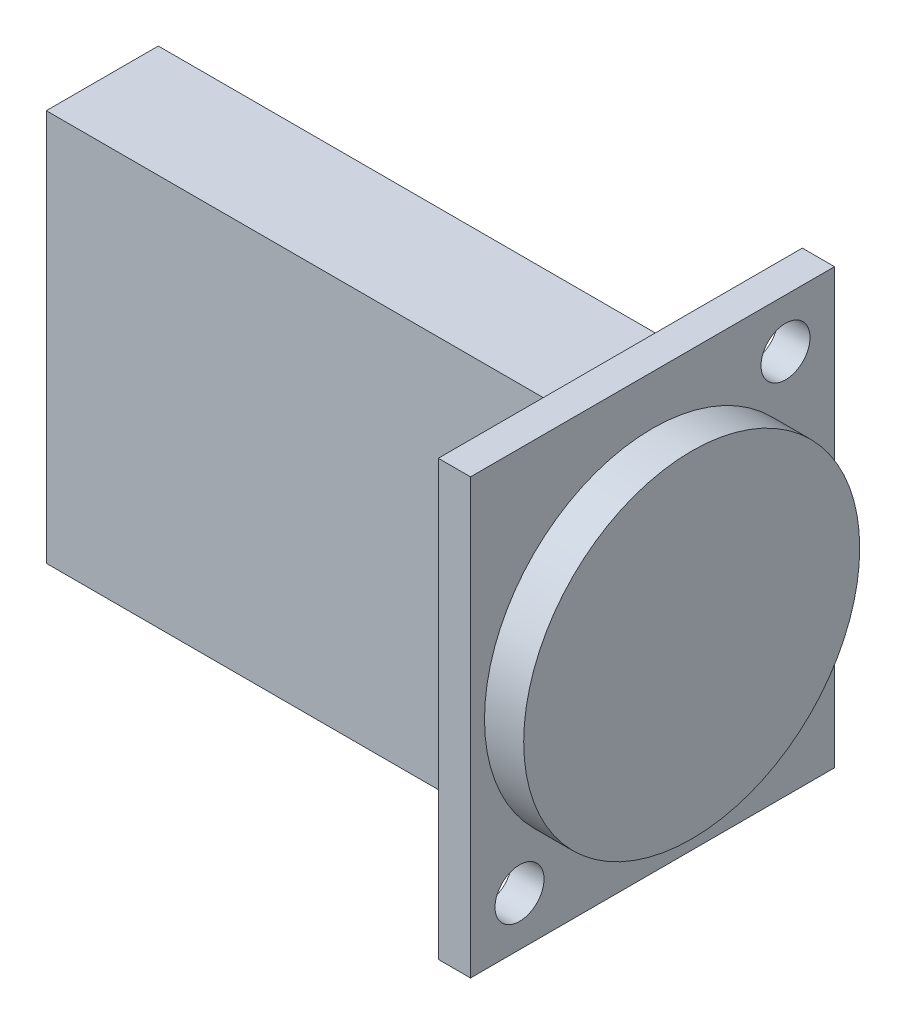
ISO-10303-21;
HEADER;
FILE_DESCRIPTION(('STEP AP214'),'2;1');
FILE_NAME('part.step','',(''),(''),'','','');
FILE_SCHEMA(('AUTOMOTIVE_DESIGN { 1 0 10303 214 1 1 1 1 }'));
ENDSEC;
DATA;
#1=APPLICATION_CONTEXT('core data for automotive mechanical design processes');
#2=APPLICATION_PROTOCOL_DEFINITION('international standard','automotive_design',2000,#1);
#3=PRODUCT_CONTEXT('',#1,'mechanical');
#4=PRODUCT('Part','Part','',(#3));
#5=PRODUCT_RELATED_PRODUCT_CATEGORY('part','',(#4));
#6=PRODUCT_DEFINITION_FORMATION('','',#4);
#7=PRODUCT_DEFINITION_CONTEXT('part definition',#1,'design');
#8=PRODUCT_DEFINITION('design','',#6,#7);
#9=PRODUCT_DEFINITION_SHAPE('','',#8);
#10=(LENGTH_UNIT() NAMED_UNIT(*) SI_UNIT(.MILLI.,.METRE.));
#11=(NAMED_UNIT(*) PLANE_ANGLE_UNIT() SI_UNIT($,.RADIAN.));
#12=(NAMED_UNIT(*) SI_UNIT($,.STERADIAN.) SOLID_ANGLE_UNIT());
#13=UNCERTAINTY_MEASURE_WITH_UNIT(LENGTH_MEASURE(1.E-05),#10,'distance_accuracy_value','');
#14=(GEOMETRIC_REPRESENTATION_CONTEXT(3) GLOBAL_UNCERTAINTY_ASSIGNED_CONTEXT((#13)) GLOBAL_UNIT_ASSIGNED_CONTEXT((#10,
#11,#12)) REPRESENTATION_CONTEXT('',''));
#15=CARTESIAN_POINT('',(0.,0.,0.));
#16=DIRECTION('',(0.,0.,1.));
#17=DIRECTION('',(1.,0.,0.));
#18=AXIS2_PLACEMENT_3D('',#15,#16,#17);
#19=CARTESIAN_POINT('',(0.,0.,0.));
#20=DIRECTION('',(1.,0.,0.));
#21=DIRECTION('',(0.,0.,-1.));
#22=AXIS2_PLACEMENT_3D('',#19,#20,#21);
#23=PLANE('',#22);
#24=CARTESIAN_POINT('',(0.,12.,-9.5));
#25=DIRECTION('',(1.,0.,0.));
#26=DIRECTION('',(0.,0.,-1.));
#27=AXIS2_PLACEMENT_3D('',#24,#25,#26);
#28=CIRCLE('',#27,1.75);
#29=CARTESIAN_POINT('',(0.,12.,-11.25));
#30=VERTEX_POINT('',#29);
#31=EDGE_CURVE('E128',#30,#30,#28,.T.);
#32=ORIENTED_EDGE('',*,*,#31,.T.);
#33=EDGE_LOOP('',(#32));
#34=FACE_BOUND('',#33,.T.);
#35=CARTESIAN_POINT('',(0.,-12.,9.5));
#36=DIRECTION('',(1.,0.,0.));
#37=DIRECTION('',(0.,0.,-1.));
#38=AXIS2_PLACEMENT_3D('',#35,#36,#37);
#39=CIRCLE('',#38,1.75);
#40=CARTESIAN_POINT('',(0.,-12.,7.75));
#41=VERTEX_POINT('',#40);
#42=EDGE_CURVE('E133',#41,#41,#39,.T.);
#43=ORIENTED_EDGE('',*,*,#42,.T.);
#44=EDGE_LOOP('',(#43));
#45=FACE_BOUND('',#44,.T.);
#46=DIRECTION('',(0.,-1.,0.));
#47=VECTOR('',#46,1.);
#48=CARTESIAN_POINT('',(0.,-15.5,13.));
#49=LINE('',#48,#47);
#50=CARTESIAN_POINT('',(0.,15.5,13.));
#51=VERTEX_POINT('',#50);
#52=CARTESIAN_POINT('',(0.,-15.5,13.));
#53=VERTEX_POINT('',#52);
#54=EDGE_CURVE('E139',#51,#53,#49,.T.);
#55=ORIENTED_EDGE('',*,*,#54,.F.);
#56=DIRECTION('',(0.,0.,1.));
#57=VECTOR('',#56,1.);
#58=CARTESIAN_POINT('',(0.,15.5,-13.));
#59=LINE('',#58,#57);
#60=CARTESIAN_POINT('',(0.,15.5,-13.));
#61=VERTEX_POINT('',#60);
#62=EDGE_CURVE('E146',#61,#51,#59,.T.);
#63=ORIENTED_EDGE('',*,*,#62,.F.);
#64=DIRECTION('',(0.,1.,0.));
#65=VECTOR('',#64,1.);
#66=CARTESIAN_POINT('',(0.,-15.5,-13.));
#67=LINE('',#66,#65);
#68=CARTESIAN_POINT('',(0.,-15.5,-13.));
#69=VERTEX_POINT('',#68);
#70=EDGE_CURVE('E157',#69,#61,#67,.T.);
#71=ORIENTED_EDGE('',*,*,#70,.F.);
#72=DIRECTION('',(0.,0.,-1.));
#73=VECTOR('',#72,1.);
#74=CARTESIAN_POINT('',(0.,-15.5,-13.));
#75=LINE('',#74,#73);
#76=EDGE_CURVE('E155',#53,#69,#75,.T.);
#77=ORIENTED_EDGE('',*,*,#76,.F.);
#78=EDGE_LOOP('',(#55,#63,#71,#77));
#79=FACE_BOUND('',#78,.T.);
#80=DIRECTION('',(0.,-1.,0.));
#81=VECTOR('',#80,1.);
#82=CARTESIAN_POINT('',(0.,-14.,-4.));
#83=LINE('',#82,#81);
#84=CARTESIAN_POINT('',(0.,14.,-4.));
#85=VERTEX_POINT('',#84);
#86=CARTESIAN_POINT('',(0.,-14.,-4.));
#87=VERTEX_POINT('',#86);
#88=EDGE_CURVE('E48',#85,#87,#83,.T.);
#89=ORIENTED_EDGE('',*,*,#88,.F.);
#90=DIRECTION('',(0.,0.,-1.));
#91=VECTOR('',#90,1.);
#92=CARTESIAN_POINT('',(0.,14.,4.));
#93=LINE('',#92,#91);
#94=CARTESIAN_POINT('',(0.,14.,4.));
#95=VERTEX_POINT('',#94);
#96=EDGE_CURVE('E52',#95,#85,#93,.T.);
#97=ORIENTED_EDGE('',*,*,#96,.F.);
#98=DIRECTION('',(0.,1.,0.));
#99=VECTOR('',#98,1.);
#100=CARTESIAN_POINT('',(0.,-14.,4.));
#101=LINE('',#100,#99);
#102=CARTESIAN_POINT('',(0.,-14.,4.));
#103=VERTEX_POINT('',#102);
#104=EDGE_CURVE('E323',#103,#95,#101,.T.);
#105=ORIENTED_EDGE('',*,*,#104,.F.);
#106=DIRECTION('',(0.,0.,1.));
#107=VECTOR('',#106,1.);
#108=CARTESIAN_POINT('',(0.,-14.,4.));
#109=LINE('',#108,#107);
#110=EDGE_CURVE('E329',#87,#103,#109,.T.);
#111=ORIENTED_EDGE('',*,*,#110,.F.);
#112=EDGE_LOOP('',(#89,#97,#105,#111));
#113=FACE_BOUND('',#112,.T.);
#114=ADVANCED_FACE('F33',(#34,#45,#79,#113),#23,.F.);
#115=CARTESIAN_POINT('',(2.3,0.,0.));
#116=DIRECTION('',(1.,0.,0.));
#117=DIRECTION('',(0.,0.,-1.));
#118=AXIS2_PLACEMENT_3D('',#115,#116,#117);
#119=PLANE('',#118);
#120=CARTESIAN_POINT('',(2.3,0.,0.));
#121=DIRECTION('',(1.,0.,0.));
#122=DIRECTION('',(0.,0.,-1.));
#123=AXIS2_PLACEMENT_3D('',#120,#121,#122);
#124=CIRCLE('',#123,12.);
#125=CARTESIAN_POINT('',(2.3,0.,-12.));
#126=VERTEX_POINT('',#125);
#127=EDGE_CURVE('E118',#126,#126,#124,.T.);
#128=ORIENTED_EDGE('',*,*,#127,.F.);
#129=EDGE_LOOP('',(#128));
#130=FACE_BOUND('',#129,.T.);
#131=CARTESIAN_POINT('',(2.3,-12.,9.5));
#132=DIRECTION('',(1.,0.,0.));
#133=DIRECTION('',(0.,0.,-1.));
#134=AXIS2_PLACEMENT_3D('',#131,#132,#133);
#135=CIRCLE('',#134,1.75);
#136=CARTESIAN_POINT('',(2.3,-12.,7.75));
#137=VERTEX_POINT('',#136);
#138=EDGE_CURVE('E136',#137,#137,#135,.T.);
#139=ORIENTED_EDGE('',*,*,#138,.F.);
#140=EDGE_LOOP('',(#139));
#141=FACE_BOUND('',#140,.T.);
#142=DIRECTION('',(0.,-1.,0.));
#143=VECTOR('',#142,1.);
#144=CARTESIAN_POINT('',(2.3,-15.5,13.));
#145=LINE('',#144,#143);
#146=CARTESIAN_POINT('',(2.3,15.5,13.));
#147=VERTEX_POINT('',#146);
#148=CARTESIAN_POINT('',(2.3,-15.5,13.));
#149=VERTEX_POINT('',#148);
#150=EDGE_CURVE('E142',#147,#149,#145,.T.);
#151=ORIENTED_EDGE('',*,*,#150,.T.);
#152=DIRECTION('',(0.,0.,-1.));
#153=VECTOR('',#152,1.);
#154=CARTESIAN_POINT('',(2.3,-15.5,-13.));
#155=LINE('',#154,#153);
#156=CARTESIAN_POINT('',(2.3,-15.5,-13.));
#157=VERTEX_POINT('',#156);
#158=EDGE_CURVE('E145',#149,#157,#155,.T.);
#159=ORIENTED_EDGE('',*,*,#158,.T.);
#160=DIRECTION('',(0.,1.,0.));
#161=VECTOR('',#160,1.);
#162=CARTESIAN_POINT('',(2.3,-15.5,-13.));
#163=LINE('',#162,#161);
#164=CARTESIAN_POINT('',(2.3,15.5,-13.));
#165=VERTEX_POINT('',#164);
#166=EDGE_CURVE('E148',#157,#165,#163,.T.);
#167=ORIENTED_EDGE('',*,*,#166,.T.);
#168=DIRECTION('',(0.,0.,1.));
#169=VECTOR('',#168,1.);
#170=CARTESIAN_POINT('',(2.3,15.5,-13.));
#171=LINE('',#170,#169);
#172=EDGE_CURVE('E150',#165,#147,#171,.T.);
#173=ORIENTED_EDGE('',*,*,#172,.T.);
#174=EDGE_LOOP('',(#151,#159,#167,#173));
#175=FACE_BOUND('',#174,.T.);
#176=CARTESIAN_POINT('',(2.3,12.,-9.5));
#177=DIRECTION('',(1.,0.,0.));
#178=DIRECTION('',(0.,0.,-1.));
#179=AXIS2_PLACEMENT_3D('',#176,#177,#178);
#180=CIRCLE('',#179,1.75);
#181=CARTESIAN_POINT('',(2.3,12.,-11.25));
#182=VERTEX_POINT('',#181);
#183=EDGE_CURVE('E130',#182,#182,#180,.T.);
#184=ORIENTED_EDGE('',*,*,#183,.F.);
#185=EDGE_LOOP('',(#184));
#186=FACE_BOUND('',#185,.T.);
#187=ADVANCED_FACE('F183',(#130,#141,#175,#186),#119,.T.);
#188=CARTESIAN_POINT('',(2.3,-15.5,13.));
#189=DIRECTION('',(0.,0.,-1.));
#190=DIRECTION('',(-1.,0.,0.));
#191=AXIS2_PLACEMENT_3D('',#188,#189,#190);
#192=PLANE('',#191);
#193=ORIENTED_EDGE('',*,*,#54,.T.);
#194=DIRECTION('',(-1.,0.,0.));
#195=VECTOR('',#194,1.);
#196=CARTESIAN_POINT('',(2.3,-15.5,13.));
#197=LINE('',#196,#195);
#198=EDGE_CURVE('E11',#149,#53,#197,.T.);
#199=ORIENTED_EDGE('',*,*,#198,.F.);
#200=ORIENTED_EDGE('',*,*,#150,.F.);
#201=DIRECTION('',(-1.,0.,0.));
#202=VECTOR('',#201,1.);
#203=CARTESIAN_POINT('',(2.3,15.5,13.));
#204=LINE('',#203,#202);
#205=EDGE_CURVE('E152',#147,#51,#204,.T.);
#206=ORIENTED_EDGE('',*,*,#205,.T.);
#207=EDGE_LOOP('',(#193,#199,#200,#206));
#208=FACE_BOUND('',#207,.T.);
#209=ADVANCED_FACE('F35',(#208),#192,.F.);
#210=CARTESIAN_POINT('',(2.3,-15.5,-13.));
#211=DIRECTION('',(0.,1.,0.));
#212=DIRECTION('',(0.,0.,1.));
#213=AXIS2_PLACEMENT_3D('',#210,#211,#212);
#214=PLANE('',#213);
#215=ORIENTED_EDGE('',*,*,#76,.T.);
#216=DIRECTION('',(-1.,0.,0.));
#217=VECTOR('',#216,1.);
#218=CARTESIAN_POINT('',(2.3,-15.5,-13.));
#219=LINE('',#218,#217);
#220=EDGE_CURVE('E41',#157,#69,#219,.T.);
#221=ORIENTED_EDGE('',*,*,#220,.F.);
#222=ORIENTED_EDGE('',*,*,#158,.F.);
#223=ORIENTED_EDGE('',*,*,#198,.T.);
#224=EDGE_LOOP('',(#215,#221,#222,#223));
#225=FACE_BOUND('',#224,.T.);
#226=ADVANCED_FACE('F185',(#225),#214,.F.);
#227=CARTESIAN_POINT('',(2.3,-15.5,-13.));
#228=DIRECTION('',(0.,0.,1.));
#229=DIRECTION('',(1.,0.,0.));
#230=AXIS2_PLACEMENT_3D('',#227,#228,#229);
#231=PLANE('',#230);
#232=ORIENTED_EDGE('',*,*,#70,.T.);
#233=DIRECTION('',(-1.,0.,0.));
#234=VECTOR('',#233,1.);
#235=CARTESIAN_POINT('',(2.3,15.5,-13.));
#236=LINE('',#235,#234);
#237=EDGE_CURVE('E162',#165,#61,#236,.T.);
#238=ORIENTED_EDGE('',*,*,#237,.F.);
#239=ORIENTED_EDGE('',*,*,#166,.F.);
#240=ORIENTED_EDGE('',*,*,#220,.T.);
#241=EDGE_LOOP('',(#232,#238,#239,#240));
#242=FACE_BOUND('',#241,.T.);
#243=ADVANCED_FACE('F169',(#242),#231,.F.);
#244=CARTESIAN_POINT('',(2.3,15.5,-13.));
#245=DIRECTION('',(0.,-1.,0.));
#246=DIRECTION('',(0.,0.,-1.));
#247=AXIS2_PLACEMENT_3D('',#244,#245,#246);
#248=PLANE('',#247);
#249=ORIENTED_EDGE('',*,*,#62,.T.);
#250=ORIENTED_EDGE('',*,*,#205,.F.);
#251=ORIENTED_EDGE('',*,*,#172,.F.);
#252=ORIENTED_EDGE('',*,*,#237,.T.);
#253=EDGE_LOOP('',(#249,#250,#251,#252));
#254=FACE_BOUND('',#253,.T.);
#255=ADVANCED_FACE('F177',(#254),#248,.F.);
#256=CARTESIAN_POINT('',(2.3,-12.,9.5));
#257=DIRECTION('',(-1.,0.,0.));
#258=DIRECTION('',(0.,0.,1.));
#259=AXIS2_PLACEMENT_3D('',#256,#257,#258);
#260=CYLINDRICAL_SURFACE('',#259,1.75);
#261=ORIENTED_EDGE('',*,*,#138,.T.);
#262=EDGE_LOOP('',(#261));
#263=FACE_BOUND('',#262,.T.);
#264=ORIENTED_EDGE('',*,*,#42,.F.);
#265=EDGE_LOOP('',(#264));
#266=FACE_BOUND('',#265,.T.);
#267=ADVANCED_FACE('F204',(#263,#266),#260,.F.);
#268=CARTESIAN_POINT('',(2.3,12.,-9.5));
#269=DIRECTION('',(-1.,0.,0.));
#270=DIRECTION('',(0.,0.,1.));
#271=AXIS2_PLACEMENT_3D('',#268,#269,#270);
#272=CYLINDRICAL_SURFACE('',#271,1.75);
#273=ORIENTED_EDGE('',*,*,#183,.T.);
#274=EDGE_LOOP('',(#273));
#275=FACE_BOUND('',#274,.T.);
#276=ORIENTED_EDGE('',*,*,#31,.F.);
#277=EDGE_LOOP('',(#276));
#278=FACE_BOUND('',#277,.T.);
#279=ADVANCED_FACE('F208',(#275,#278),#272,.F.);
#280=CARTESIAN_POINT('',(5.1,0.,0.));
#281=DIRECTION('',(-1.,0.,0.));
#282=DIRECTION('',(0.,0.,1.));
#283=AXIS2_PLACEMENT_3D('',#280,#281,#282);
#284=CYLINDRICAL_SURFACE('',#283,12.);
#285=CARTESIAN_POINT('',(5.1,0.,0.));
#286=DIRECTION('',(1.,0.,0.));
#287=DIRECTION('',(0.,0.,-1.));
#288=AXIS2_PLACEMENT_3D('',#285,#286,#287);
#289=CIRCLE('',#288,12.);
#290=CARTESIAN_POINT('',(5.1,0.,-12.));
#291=VERTEX_POINT('',#290);
#292=EDGE_CURVE('E121',#291,#291,#289,.T.);
#293=ORIENTED_EDGE('',*,*,#292,.F.);
#294=EDGE_LOOP('',(#293));
#295=FACE_BOUND('',#294,.T.);
#296=ORIENTED_EDGE('',*,*,#127,.T.);
#297=EDGE_LOOP('',(#296));
#298=FACE_BOUND('',#297,.T.);
#299=ADVANCED_FACE('F213',(#295,#298),#284,.T.);
#300=CARTESIAN_POINT('',(5.1,0.,0.));
#301=DIRECTION('',(1.,0.,0.));
#302=DIRECTION('',(0.,0.,-1.));
#303=AXIS2_PLACEMENT_3D('',#300,#301,#302);
#304=PLANE('',#303);
#305=ORIENTED_EDGE('',*,*,#292,.T.);
#306=EDGE_LOOP('',(#305));
#307=FACE_BOUND('',#306,.T.);
#308=ADVANCED_FACE('F220',(#307),#304,.T.);
#309=CARTESIAN_POINT('',(-37.,-14.,-4.));
#310=DIRECTION('',(0.,0.,1.));
#311=DIRECTION('',(1.,0.,0.));
#312=AXIS2_PLACEMENT_3D('',#309,#310,#311);
#313=PLANE('',#312);
#314=ORIENTED_EDGE('',*,*,#88,.T.);
#315=DIRECTION('',(1.,0.,0.));
#316=VECTOR('',#315,1.);
#317=CARTESIAN_POINT('',(-37.,-14.,-4.));
#318=LINE('',#317,#316);
#319=CARTESIAN_POINT('',(-37.,-14.,-4.));
#320=VERTEX_POINT('',#319);
#321=EDGE_CURVE('E101',#320,#87,#318,.T.);
#322=ORIENTED_EDGE('',*,*,#321,.F.);
#323=DIRECTION('',(0.,-1.,0.));
#324=VECTOR('',#323,1.);
#325=CARTESIAN_POINT('',(-37.,-14.,-4.));
#326=LINE('',#325,#324);
#327=CARTESIAN_POINT('',(-37.,14.,-4.));
#328=VERTEX_POINT('',#327);
#329=EDGE_CURVE('E107',#328,#320,#326,.T.);
#330=ORIENTED_EDGE('',*,*,#329,.F.);
#331=DIRECTION('',(1.,0.,0.));
#332=VECTOR('',#331,1.);
#333=CARTESIAN_POINT('',(-37.,14.,-4.));
#334=LINE('',#333,#332);
#335=EDGE_CURVE('E321',#328,#85,#334,.T.);
#336=ORIENTED_EDGE('',*,*,#335,.T.);
#337=EDGE_LOOP('',(#314,#322,#330,#336));
#338=FACE_BOUND('',#337,.T.);
#339=ADVANCED_FACE('F117',(#338),#313,.F.);
#340=CARTESIAN_POINT('',(-37.,-14.,4.));
#341=DIRECTION('',(0.,1.,0.));
#342=DIRECTION('',(0.,0.,1.));
#343=AXIS2_PLACEMENT_3D('',#340,#341,#342);
#344=PLANE('',#343);
#345=ORIENTED_EDGE('',*,*,#110,.T.);
#346=DIRECTION('',(1.,0.,0.));
#347=VECTOR('',#346,1.);
#348=CARTESIAN_POINT('',(-37.,-14.,4.));
#349=LINE('',#348,#347);
#350=CARTESIAN_POINT('',(-37.,-14.,4.));
#351=VERTEX_POINT('',#350);
#352=EDGE_CURVE('E103',#351,#103,#349,.T.);
#353=ORIENTED_EDGE('',*,*,#352,.F.);
#354=DIRECTION('',(0.,0.,1.));
#355=VECTOR('',#354,1.);
#356=CARTESIAN_POINT('',(-37.,-14.,4.));
#357=LINE('',#356,#355);
#358=EDGE_CURVE('E96',#320,#351,#357,.T.);
#359=ORIENTED_EDGE('',*,*,#358,.F.);
#360=ORIENTED_EDGE('',*,*,#321,.T.);
#361=EDGE_LOOP('',(#345,#353,#359,#360));
#362=FACE_BOUND('',#361,.T.);
#363=ADVANCED_FACE('F99',(#362),#344,.F.);
#364=CARTESIAN_POINT('',(-37.,-14.,4.));
#365=DIRECTION('',(0.,0.,-1.));
#366=DIRECTION('',(-1.,0.,0.));
#367=AXIS2_PLACEMENT_3D('',#364,#365,#366);
#368=PLANE('',#367);
#369=ORIENTED_EDGE('',*,*,#104,.T.);
#370=DIRECTION('',(1.,0.,0.));
#371=VECTOR('',#370,1.);
#372=CARTESIAN_POINT('',(-37.,14.,4.));
#373=LINE('',#372,#371);
#374=CARTESIAN_POINT('',(-37.,14.,4.));
#375=VERTEX_POINT('',#374);
#376=EDGE_CURVE('E123',#375,#95,#373,.T.);
#377=ORIENTED_EDGE('',*,*,#376,.F.);
#378=DIRECTION('',(0.,1.,0.));
#379=VECTOR('',#378,1.);
#380=CARTESIAN_POINT('',(-37.,-14.,4.));
#381=LINE('',#380,#379);
#382=EDGE_CURVE('E106',#351,#375,#381,.T.);
#383=ORIENTED_EDGE('',*,*,#382,.F.);
#384=ORIENTED_EDGE('',*,*,#352,.T.);
#385=EDGE_LOOP('',(#369,#377,#383,#384));
#386=FACE_BOUND('',#385,.T.);
#387=ADVANCED_FACE('F229',(#386),#368,.F.);
#388=CARTESIAN_POINT('',(-37.,14.,4.));
#389=DIRECTION('',(0.,-1.,0.));
#390=DIRECTION('',(0.,0.,-1.));
#391=AXIS2_PLACEMENT_3D('',#388,#389,#390);
#392=PLANE('',#391);
#393=ORIENTED_EDGE('',*,*,#96,.T.);
#394=ORIENTED_EDGE('',*,*,#335,.F.);
#395=DIRECTION('',(0.,0.,-1.));
#396=VECTOR('',#395,1.);
#397=CARTESIAN_POINT('',(-37.,14.,4.));
#398=LINE('',#397,#396);
#399=EDGE_CURVE('E112',#375,#328,#398,.T.);
#400=ORIENTED_EDGE('',*,*,#399,.F.);
#401=ORIENTED_EDGE('',*,*,#376,.T.);
#402=EDGE_LOOP('',(#393,#394,#400,#401));
#403=FACE_BOUND('',#402,.T.);
#404=ADVANCED_FACE('F232',(#403),#392,.F.);
#405=CARTESIAN_POINT('',(-37.,0.,0.));
#406=DIRECTION('',(-1.,0.,0.));
#407=DIRECTION('',(0.,0.,1.));
#408=AXIS2_PLACEMENT_3D('',#405,#406,#407);
#409=PLANE('',#408);
#410=ORIENTED_EDGE('',*,*,#329,.T.);
#411=ORIENTED_EDGE('',*,*,#358,.T.);
#412=ORIENTED_EDGE('',*,*,#382,.T.);
#413=ORIENTED_EDGE('',*,*,#399,.T.);
#414=EDGE_LOOP('',(#410,#411,#412,#413));
#415=FACE_BOUND('',#414,.T.);
#416=ADVANCED_FACE('F110',(#415),#409,.T.);
#417=CLOSED_SHELL('',(#114,#187,#209,#226,#243,#255,#267,#279,#299,#308,#339,#363,#387,#404,#416));
#418=MANIFOLD_SOLID_BREP('B2',#417);
#419=ADVANCED_BREP_SHAPE_REPRESENTATION('',(#18,#418),#14);
#420=SHAPE_DEFINITION_REPRESENTATION(#9,#419);
ENDSEC;
END-ISO-10303-21;
